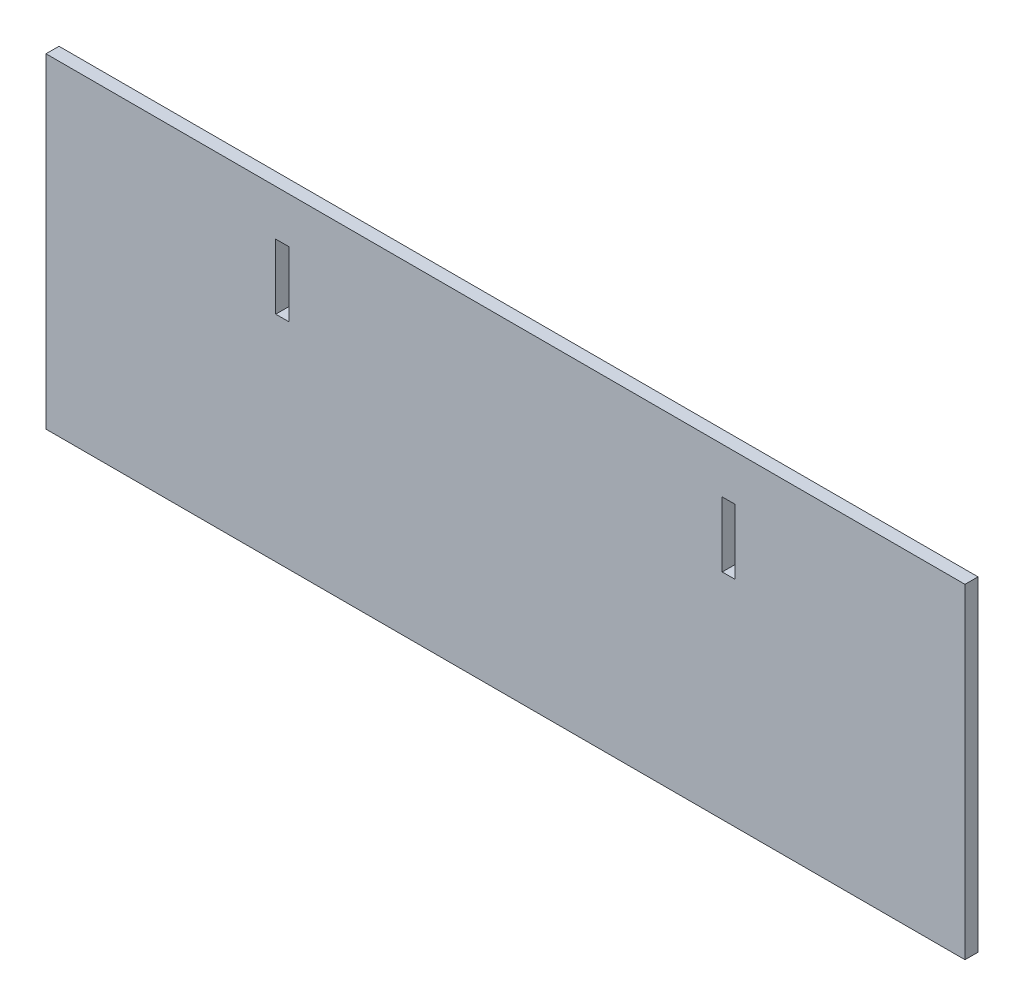
ISO-10303-21;
HEADER;
FILE_DESCRIPTION(('STEP AP214'),'2;1');
FILE_NAME('part.step','',(''),(''),'','','');
FILE_SCHEMA(('AUTOMOTIVE_DESIGN { 1 0 10303 214 1 1 1 1 }'));
ENDSEC;
DATA;
#1=APPLICATION_CONTEXT('core data for automotive mechanical design processes');
#2=APPLICATION_PROTOCOL_DEFINITION('international standard','automotive_design',2000,#1);
#3=PRODUCT_CONTEXT('',#1,'mechanical');
#4=PRODUCT('Part','Part','',(#3));
#5=PRODUCT_RELATED_PRODUCT_CATEGORY('part','',(#4));
#6=PRODUCT_DEFINITION_FORMATION('','',#4);
#7=PRODUCT_DEFINITION_CONTEXT('part definition',#1,'design');
#8=PRODUCT_DEFINITION('design','',#6,#7);
#9=PRODUCT_DEFINITION_SHAPE('','',#8);
#10=(LENGTH_UNIT() NAMED_UNIT(*) SI_UNIT(.MILLI.,.METRE.));
#11=(NAMED_UNIT(*) PLANE_ANGLE_UNIT() SI_UNIT($,.RADIAN.));
#12=(NAMED_UNIT(*) SI_UNIT($,.STERADIAN.) SOLID_ANGLE_UNIT());
#13=UNCERTAINTY_MEASURE_WITH_UNIT(LENGTH_MEASURE(1.E-05),#10,'distance_accuracy_value','');
#14=(GEOMETRIC_REPRESENTATION_CONTEXT(3) GLOBAL_UNCERTAINTY_ASSIGNED_CONTEXT((#13)) GLOBAL_UNIT_ASSIGNED_CONTEXT((#10,
#11,#12)) REPRESENTATION_CONTEXT('',''));
#15=CARTESIAN_POINT('',(0.,0.,0.));
#16=DIRECTION('',(0.,0.,1.));
#17=DIRECTION('',(1.,0.,0.));
#18=AXIS2_PLACEMENT_3D('',#15,#16,#17);
#19=CARTESIAN_POINT('',(0.,0.,3.));
#20=DIRECTION('',(0.,0.,-1.));
#21=DIRECTION('',(-1.,0.,0.));
#22=AXIS2_PLACEMENT_3D('',#19,#20,#21);
#23=PLANE('',#22);
#24=DIRECTION('',(0.,-1.,0.));
#25=VECTOR('',#24,1.);
#26=CARTESIAN_POINT('',(53.,64.47224362,3.));
#27=LINE('',#26,#25);
#28=CARTESIAN_POINT('',(53.,64.47224362,3.));
#29=VERTEX_POINT('',#28);
#30=CARTESIAN_POINT('',(53.,49.47224362,3.));
#31=VERTEX_POINT('',#30);
#32=EDGE_CURVE('E158',#29,#31,#27,.T.);
#33=ORIENTED_EDGE('',*,*,#32,.F.);
#34=DIRECTION('',(-1.,0.,0.));
#35=VECTOR('',#34,1.);
#36=CARTESIAN_POINT('',(53.,64.47224362,3.));
#37=LINE('',#36,#35);
#38=CARTESIAN_POINT('',(56.,64.47224362,3.));
#39=VERTEX_POINT('',#38);
#40=EDGE_CURVE('E166',#39,#29,#37,.T.);
#41=ORIENTED_EDGE('',*,*,#40,.F.);
#42=DIRECTION('',(0.,1.,0.));
#43=VECTOR('',#42,1.);
#44=CARTESIAN_POINT('',(56.,64.47224362,3.));
#45=LINE('',#44,#43);
#46=CARTESIAN_POINT('',(56.,49.47224362,3.));
#47=VERTEX_POINT('',#46);
#48=EDGE_CURVE('E163',#47,#39,#45,.T.);
#49=ORIENTED_EDGE('',*,*,#48,.F.);
#50=DIRECTION('',(1.,0.,0.));
#51=VECTOR('',#50,1.);
#52=CARTESIAN_POINT('',(53.,49.47224362,3.));
#53=LINE('',#52,#51);
#54=EDGE_CURVE('E160',#31,#47,#53,.T.);
#55=ORIENTED_EDGE('',*,*,#54,.F.);
#56=EDGE_LOOP('',(#33,#41,#49,#55));
#57=FACE_BOUND('',#56,.T.);
#58=DIRECTION('',(0.,-1.,0.));
#59=VECTOR('',#58,1.);
#60=CARTESIAN_POINT('',(0.,0.,3.));
#61=LINE('',#60,#59);
#62=CARTESIAN_POINT('',(0.,75.,3.));
#63=VERTEX_POINT('',#62);
#64=CARTESIAN_POINT('',(0.,0.,3.));
#65=VERTEX_POINT('',#64);
#66=EDGE_CURVE('E189',#63,#65,#61,.T.);
#67=ORIENTED_EDGE('',*,*,#66,.T.);
#68=DIRECTION('',(1.,0.,0.));
#69=VECTOR('',#68,1.);
#70=CARTESIAN_POINT('',(0.,0.,3.));
#71=LINE('',#70,#69);
#72=CARTESIAN_POINT('',(212.,0.,3.));
#73=VERTEX_POINT('',#72);
#74=EDGE_CURVE('E192',#65,#73,#71,.T.);
#75=ORIENTED_EDGE('',*,*,#74,.T.);
#76=DIRECTION('',(0.,1.,0.));
#77=VECTOR('',#76,1.);
#78=CARTESIAN_POINT('',(212.,0.,3.));
#79=LINE('',#78,#77);
#80=CARTESIAN_POINT('',(212.,75.,3.));
#81=VERTEX_POINT('',#80);
#82=EDGE_CURVE('E195',#73,#81,#79,.T.);
#83=ORIENTED_EDGE('',*,*,#82,.T.);
#84=DIRECTION('',(-1.,0.,0.));
#85=VECTOR('',#84,1.);
#86=CARTESIAN_POINT('',(0.,75.,3.));
#87=LINE('',#86,#85);
#88=EDGE_CURVE('E197',#81,#63,#87,.T.);
#89=ORIENTED_EDGE('',*,*,#88,.T.);
#90=EDGE_LOOP('',(#67,#75,#83,#89));
#91=FACE_BOUND('',#90,.T.);
#92=DIRECTION('',(0.,-1.,0.));
#93=VECTOR('',#92,1.);
#94=CARTESIAN_POINT('',(156.,64.47224362,3.));
#95=LINE('',#94,#93);
#96=CARTESIAN_POINT('',(156.,64.47224362,3.));
#97=VERTEX_POINT('',#96);
#98=CARTESIAN_POINT('',(156.,49.47224362,3.));
#99=VERTEX_POINT('',#98);
#100=EDGE_CURVE('E122',#97,#99,#95,.T.);
#101=ORIENTED_EDGE('',*,*,#100,.F.);
#102=DIRECTION('',(-1.,0.,0.));
#103=VECTOR('',#102,1.);
#104=CARTESIAN_POINT('',(156.,64.47224362,3.));
#105=LINE('',#104,#103);
#106=CARTESIAN_POINT('',(159.,64.47224362,3.));
#107=VERTEX_POINT('',#106);
#108=EDGE_CURVE('E144',#107,#97,#105,.T.);
#109=ORIENTED_EDGE('',*,*,#108,.F.);
#110=DIRECTION('',(0.,1.,0.));
#111=VECTOR('',#110,1.);
#112=CARTESIAN_POINT('',(159.,64.47224362,3.));
#113=LINE('',#112,#111);
#114=CARTESIAN_POINT('',(159.,49.47224362,3.));
#115=VERTEX_POINT('',#114);
#116=EDGE_CURVE('E142',#115,#107,#113,.T.);
#117=ORIENTED_EDGE('',*,*,#116,.F.);
#118=DIRECTION('',(1.,0.,0.));
#119=VECTOR('',#118,1.);
#120=CARTESIAN_POINT('',(156.,49.47224362,3.));
#121=LINE('',#120,#119);
#122=EDGE_CURVE('E130',#99,#115,#121,.T.);
#123=ORIENTED_EDGE('',*,*,#122,.F.);
#124=EDGE_LOOP('',(#101,#109,#117,#123));
#125=FACE_BOUND('',#124,.T.);
#126=ADVANCED_FACE('F33',(#57,#91,#125),#23,.F.);
#127=CARTESIAN_POINT('',(0.,0.,0.));
#128=DIRECTION('',(0.,0.,-1.));
#129=DIRECTION('',(-1.,0.,0.));
#130=AXIS2_PLACEMENT_3D('',#127,#128,#129);
#131=PLANE('',#130);
#132=DIRECTION('',(0.,-1.,0.));
#133=VECTOR('',#132,1.);
#134=CARTESIAN_POINT('',(0.,0.,0.));
#135=LINE('',#134,#133);
#136=CARTESIAN_POINT('',(0.,75.,0.));
#137=VERTEX_POINT('',#136);
#138=CARTESIAN_POINT('',(0.,0.,0.));
#139=VERTEX_POINT('',#138);
#140=EDGE_CURVE('E188',#137,#139,#135,.T.);
#141=ORIENTED_EDGE('',*,*,#140,.F.);
#142=DIRECTION('',(-1.,0.,0.));
#143=VECTOR('',#142,1.);
#144=CARTESIAN_POINT('',(0.,75.,0.));
#145=LINE('',#144,#143);
#146=CARTESIAN_POINT('',(212.,75.,0.));
#147=VERTEX_POINT('',#146);
#148=EDGE_CURVE('E193',#147,#137,#145,.T.);
#149=ORIENTED_EDGE('',*,*,#148,.F.);
#150=DIRECTION('',(0.,1.,0.));
#151=VECTOR('',#150,1.);
#152=CARTESIAN_POINT('',(212.,0.,0.));
#153=LINE('',#152,#151);
#154=CARTESIAN_POINT('',(212.,0.,0.));
#155=VERTEX_POINT('',#154);
#156=EDGE_CURVE('E204',#155,#147,#153,.T.);
#157=ORIENTED_EDGE('',*,*,#156,.F.);
#158=DIRECTION('',(1.,0.,0.));
#159=VECTOR('',#158,1.);
#160=CARTESIAN_POINT('',(0.,0.,0.));
#161=LINE('',#160,#159);
#162=EDGE_CURVE('E202',#139,#155,#161,.T.);
#163=ORIENTED_EDGE('',*,*,#162,.F.);
#164=EDGE_LOOP('',(#141,#149,#157,#163));
#165=FACE_BOUND('',#164,.T.);
#166=DIRECTION('',(-1.,0.,0.));
#167=VECTOR('',#166,1.);
#168=CARTESIAN_POINT('',(53.,64.47224362,0.));
#169=LINE('',#168,#167);
#170=CARTESIAN_POINT('',(56.,64.47224362,0.));
#171=VERTEX_POINT('',#170);
#172=CARTESIAN_POINT('',(53.,64.47224362,0.));
#173=VERTEX_POINT('',#172);
#174=EDGE_CURVE('E161',#171,#173,#169,.T.);
#175=ORIENTED_EDGE('',*,*,#174,.T.);
#176=DIRECTION('',(0.,-1.,0.));
#177=VECTOR('',#176,1.);
#178=CARTESIAN_POINT('',(53.,64.47224362,0.));
#179=LINE('',#178,#177);
#180=CARTESIAN_POINT('',(53.,49.47224362,0.));
#181=VERTEX_POINT('',#180);
#182=EDGE_CURVE('E138',#173,#181,#179,.T.);
#183=ORIENTED_EDGE('',*,*,#182,.T.);
#184=DIRECTION('',(1.,0.,0.));
#185=VECTOR('',#184,1.);
#186=CARTESIAN_POINT('',(53.,49.47224362,0.));
#187=LINE('',#186,#185);
#188=CARTESIAN_POINT('',(56.,49.47224362,0.));
#189=VERTEX_POINT('',#188);
#190=EDGE_CURVE('E171',#181,#189,#187,.T.);
#191=ORIENTED_EDGE('',*,*,#190,.T.);
#192=DIRECTION('',(0.,1.,0.));
#193=VECTOR('',#192,1.);
#194=CARTESIAN_POINT('',(56.,64.47224362,0.));
#195=LINE('',#194,#193);
#196=EDGE_CURVE('E174',#189,#171,#195,.T.);
#197=ORIENTED_EDGE('',*,*,#196,.T.);
#198=EDGE_LOOP('',(#175,#183,#191,#197));
#199=FACE_BOUND('',#198,.T.);
#200=DIRECTION('',(-1.,0.,0.));
#201=VECTOR('',#200,1.);
#202=CARTESIAN_POINT('',(156.,64.47224362,0.));
#203=LINE('',#202,#201);
#204=CARTESIAN_POINT('',(159.,64.47224362,0.));
#205=VERTEX_POINT('',#204);
#206=CARTESIAN_POINT('',(156.,64.47224362,0.));
#207=VERTEX_POINT('',#206);
#208=EDGE_CURVE('E131',#205,#207,#203,.T.);
#209=ORIENTED_EDGE('',*,*,#208,.T.);
#210=DIRECTION('',(0.,-1.,0.));
#211=VECTOR('',#210,1.);
#212=CARTESIAN_POINT('',(156.,64.47224362,0.));
#213=LINE('',#212,#211);
#214=CARTESIAN_POINT('',(156.,49.47224362,0.));
#215=VERTEX_POINT('',#214);
#216=EDGE_CURVE('E56',#207,#215,#213,.T.);
#217=ORIENTED_EDGE('',*,*,#216,.T.);
#218=DIRECTION('',(1.,0.,0.));
#219=VECTOR('',#218,1.);
#220=CARTESIAN_POINT('',(156.,49.47224362,0.));
#221=LINE('',#220,#219);
#222=CARTESIAN_POINT('',(159.,49.47224362,0.));
#223=VERTEX_POINT('',#222);
#224=EDGE_CURVE('E137',#215,#223,#221,.T.);
#225=ORIENTED_EDGE('',*,*,#224,.T.);
#226=DIRECTION('',(0.,1.,0.));
#227=VECTOR('',#226,1.);
#228=CARTESIAN_POINT('',(159.,64.47224362,0.));
#229=LINE('',#228,#227);
#230=EDGE_CURVE('E150',#223,#205,#229,.T.);
#231=ORIENTED_EDGE('',*,*,#230,.T.);
#232=EDGE_LOOP('',(#209,#217,#225,#231));
#233=FACE_BOUND('',#232,.T.);
#234=ADVANCED_FACE('F222',(#165,#199,#233),#131,.T.);
#235=CARTESIAN_POINT('',(0.,0.,3.));
#236=DIRECTION('',(1.,0.,0.));
#237=DIRECTION('',(0.,0.,-1.));
#238=AXIS2_PLACEMENT_3D('',#235,#236,#237);
#239=PLANE('',#238);
#240=ORIENTED_EDGE('',*,*,#140,.T.);
#241=DIRECTION('',(0.,0.,-1.));
#242=VECTOR('',#241,1.);
#243=CARTESIAN_POINT('',(0.,0.,3.));
#244=LINE('',#243,#242);
#245=EDGE_CURVE('E11',#65,#139,#244,.T.);
#246=ORIENTED_EDGE('',*,*,#245,.F.);
#247=ORIENTED_EDGE('',*,*,#66,.F.);
#248=DIRECTION('',(0.,0.,-1.));
#249=VECTOR('',#248,1.);
#250=CARTESIAN_POINT('',(0.,75.,3.));
#251=LINE('',#250,#249);
#252=EDGE_CURVE('E199',#63,#137,#251,.T.);
#253=ORIENTED_EDGE('',*,*,#252,.T.);
#254=EDGE_LOOP('',(#240,#246,#247,#253));
#255=FACE_BOUND('',#254,.T.);
#256=ADVANCED_FACE('F35',(#255),#239,.F.);
#257=CARTESIAN_POINT('',(0.,0.,3.));
#258=DIRECTION('',(0.,1.,0.));
#259=DIRECTION('',(0.,0.,1.));
#260=AXIS2_PLACEMENT_3D('',#257,#258,#259);
#261=PLANE('',#260);
#262=ORIENTED_EDGE('',*,*,#162,.T.);
#263=DIRECTION('',(0.,0.,-1.));
#264=VECTOR('',#263,1.);
#265=CARTESIAN_POINT('',(212.,0.,3.));
#266=LINE('',#265,#264);
#267=EDGE_CURVE('E41',#73,#155,#266,.T.);
#268=ORIENTED_EDGE('',*,*,#267,.F.);
#269=ORIENTED_EDGE('',*,*,#74,.F.);
#270=ORIENTED_EDGE('',*,*,#245,.T.);
#271=EDGE_LOOP('',(#262,#268,#269,#270));
#272=FACE_BOUND('',#271,.T.);
#273=ADVANCED_FACE('F232',(#272),#261,.F.);
#274=CARTESIAN_POINT('',(212.,0.,3.));
#275=DIRECTION('',(-1.,0.,0.));
#276=DIRECTION('',(0.,0.,1.));
#277=AXIS2_PLACEMENT_3D('',#274,#275,#276);
#278=PLANE('',#277);
#279=ORIENTED_EDGE('',*,*,#156,.T.);
#280=DIRECTION('',(0.,0.,-1.));
#281=VECTOR('',#280,1.);
#282=CARTESIAN_POINT('',(212.,75.,3.));
#283=LINE('',#282,#281);
#284=EDGE_CURVE('E209',#81,#147,#283,.T.);
#285=ORIENTED_EDGE('',*,*,#284,.F.);
#286=ORIENTED_EDGE('',*,*,#82,.F.);
#287=ORIENTED_EDGE('',*,*,#267,.T.);
#288=EDGE_LOOP('',(#279,#285,#286,#287));
#289=FACE_BOUND('',#288,.T.);
#290=ADVANCED_FACE('F216',(#289),#278,.F.);
#291=CARTESIAN_POINT('',(0.,75.,3.));
#292=DIRECTION('',(0.,-1.,0.));
#293=DIRECTION('',(0.,0.,-1.));
#294=AXIS2_PLACEMENT_3D('',#291,#292,#293);
#295=PLANE('',#294);
#296=ORIENTED_EDGE('',*,*,#148,.T.);
#297=ORIENTED_EDGE('',*,*,#252,.F.);
#298=ORIENTED_EDGE('',*,*,#88,.F.);
#299=ORIENTED_EDGE('',*,*,#284,.T.);
#300=EDGE_LOOP('',(#296,#297,#298,#299));
#301=FACE_BOUND('',#300,.T.);
#302=ADVANCED_FACE('F226',(#301),#295,.F.);
#303=CARTESIAN_POINT('',(53.,64.47224362,3.));
#304=DIRECTION('',(1.,0.,0.));
#305=DIRECTION('',(0.,0.,-1.));
#306=AXIS2_PLACEMENT_3D('',#303,#304,#305);
#307=PLANE('',#306);
#308=ORIENTED_EDGE('',*,*,#182,.F.);
#309=DIRECTION('',(0.,0.,-1.));
#310=VECTOR('',#309,1.);
#311=CARTESIAN_POINT('',(53.,64.47224362,3.));
#312=LINE('',#311,#310);
#313=EDGE_CURVE('E168',#29,#173,#312,.T.);
#314=ORIENTED_EDGE('',*,*,#313,.F.);
#315=ORIENTED_EDGE('',*,*,#32,.T.);
#316=DIRECTION('',(0.,0.,-1.));
#317=VECTOR('',#316,1.);
#318=CARTESIAN_POINT('',(53.,49.47224362,3.));
#319=LINE('',#318,#317);
#320=EDGE_CURVE('E185',#31,#181,#319,.T.);
#321=ORIENTED_EDGE('',*,*,#320,.T.);
#322=EDGE_LOOP('',(#308,#314,#315,#321));
#323=FACE_BOUND('',#322,.T.);
#324=ADVANCED_FACE('F248',(#323),#307,.T.);
#325=CARTESIAN_POINT('',(53.,49.47224362,3.));
#326=DIRECTION('',(0.,1.,0.));
#327=DIRECTION('',(-1.,0.,0.));
#328=AXIS2_PLACEMENT_3D('',#325,#326,#327);
#329=PLANE('',#328);
#330=ORIENTED_EDGE('',*,*,#190,.F.);
#331=ORIENTED_EDGE('',*,*,#320,.F.);
#332=ORIENTED_EDGE('',*,*,#54,.T.);
#333=DIRECTION('',(0.,0.,-1.));
#334=VECTOR('',#333,1.);
#335=CARTESIAN_POINT('',(56.,49.47224362,3.));
#336=LINE('',#335,#334);
#337=EDGE_CURVE('E183',#47,#189,#336,.T.);
#338=ORIENTED_EDGE('',*,*,#337,.T.);
#339=EDGE_LOOP('',(#330,#331,#332,#338));
#340=FACE_BOUND('',#339,.T.);
#341=ADVANCED_FACE('F255',(#340),#329,.T.);
#342=CARTESIAN_POINT('',(56.,64.47224362,3.));
#343=DIRECTION('',(-1.,0.,0.));
#344=DIRECTION('',(0.,-1.,0.));
#345=AXIS2_PLACEMENT_3D('',#342,#343,#344);
#346=PLANE('',#345);
#347=ORIENTED_EDGE('',*,*,#196,.F.);
#348=ORIENTED_EDGE('',*,*,#337,.F.);
#349=ORIENTED_EDGE('',*,*,#48,.T.);
#350=DIRECTION('',(0.,0.,-1.));
#351=VECTOR('',#350,1.);
#352=CARTESIAN_POINT('',(56.,64.47224362,3.));
#353=LINE('',#352,#351);
#354=EDGE_CURVE('E181',#39,#171,#353,.T.);
#355=ORIENTED_EDGE('',*,*,#354,.T.);
#356=EDGE_LOOP('',(#347,#348,#349,#355));
#357=FACE_BOUND('',#356,.T.);
#358=ADVANCED_FACE('F260',(#357),#346,.T.);
#359=CARTESIAN_POINT('',(53.,64.47224362,3.));
#360=DIRECTION('',(0.,-1.,0.));
#361=DIRECTION('',(1.,0.,0.));
#362=AXIS2_PLACEMENT_3D('',#359,#360,#361);
#363=PLANE('',#362);
#364=ORIENTED_EDGE('',*,*,#174,.F.);
#365=ORIENTED_EDGE('',*,*,#354,.F.);
#366=ORIENTED_EDGE('',*,*,#40,.T.);
#367=ORIENTED_EDGE('',*,*,#313,.T.);
#368=EDGE_LOOP('',(#364,#365,#366,#367));
#369=FACE_BOUND('',#368,.T.);
#370=ADVANCED_FACE('F266',(#369),#363,.T.);
#371=CARTESIAN_POINT('',(156.,64.47224362,3.));
#372=DIRECTION('',(1.,0.,0.));
#373=DIRECTION('',(0.,0.,-1.));
#374=AXIS2_PLACEMENT_3D('',#371,#372,#373);
#375=PLANE('',#374);
#376=ORIENTED_EDGE('',*,*,#216,.F.);
#377=DIRECTION('',(0.,0.,-1.));
#378=VECTOR('',#377,1.);
#379=CARTESIAN_POINT('',(156.,64.47224362,3.));
#380=LINE('',#379,#378);
#381=EDGE_CURVE('E126',#97,#207,#380,.T.);
#382=ORIENTED_EDGE('',*,*,#381,.F.);
#383=ORIENTED_EDGE('',*,*,#100,.T.);
#384=DIRECTION('',(0.,0.,-1.));
#385=VECTOR('',#384,1.);
#386=CARTESIAN_POINT('',(156.,49.47224362,3.));
#387=LINE('',#386,#385);
#388=EDGE_CURVE('E125',#99,#215,#387,.T.);
#389=ORIENTED_EDGE('',*,*,#388,.T.);
#390=EDGE_LOOP('',(#376,#382,#383,#389));
#391=FACE_BOUND('',#390,.T.);
#392=ADVANCED_FACE('F124',(#391),#375,.T.);
#393=CARTESIAN_POINT('',(156.,49.47224362,3.));
#394=DIRECTION('',(0.,1.,0.));
#395=DIRECTION('',(0.,0.,1.));
#396=AXIS2_PLACEMENT_3D('',#393,#394,#395);
#397=PLANE('',#396);
#398=ORIENTED_EDGE('',*,*,#224,.F.);
#399=ORIENTED_EDGE('',*,*,#388,.F.);
#400=ORIENTED_EDGE('',*,*,#122,.T.);
#401=DIRECTION('',(0.,0.,-1.));
#402=VECTOR('',#401,1.);
#403=CARTESIAN_POINT('',(159.,49.47224362,3.));
#404=LINE('',#403,#402);
#405=EDGE_CURVE('E139',#115,#223,#404,.T.);
#406=ORIENTED_EDGE('',*,*,#405,.T.);
#407=EDGE_LOOP('',(#398,#399,#400,#406));
#408=FACE_BOUND('',#407,.T.);
#409=ADVANCED_FACE('F134',(#408),#397,.T.);
#410=CARTESIAN_POINT('',(159.,64.47224362,3.));
#411=DIRECTION('',(-1.,0.,0.));
#412=DIRECTION('',(0.,0.,1.));
#413=AXIS2_PLACEMENT_3D('',#410,#411,#412);
#414=PLANE('',#413);
#415=ORIENTED_EDGE('',*,*,#230,.F.);
#416=ORIENTED_EDGE('',*,*,#405,.F.);
#417=ORIENTED_EDGE('',*,*,#116,.T.);
#418=DIRECTION('',(0.,0.,-1.));
#419=VECTOR('',#418,1.);
#420=CARTESIAN_POINT('',(159.,64.47224362,3.));
#421=LINE('',#420,#419);
#422=EDGE_CURVE('E48',#107,#205,#421,.T.);
#423=ORIENTED_EDGE('',*,*,#422,.T.);
#424=EDGE_LOOP('',(#415,#416,#417,#423));
#425=FACE_BOUND('',#424,.T.);
#426=ADVANCED_FACE('F285',(#425),#414,.T.);
#427=CARTESIAN_POINT('',(156.,64.47224362,3.));
#428=DIRECTION('',(0.,-1.,0.));
#429=DIRECTION('',(0.,0.,-1.));
#430=AXIS2_PLACEMENT_3D('',#427,#428,#429);
#431=PLANE('',#430);
#432=ORIENTED_EDGE('',*,*,#208,.F.);
#433=ORIENTED_EDGE('',*,*,#422,.F.);
#434=ORIENTED_EDGE('',*,*,#108,.T.);
#435=ORIENTED_EDGE('',*,*,#381,.T.);
#436=EDGE_LOOP('',(#432,#433,#434,#435));
#437=FACE_BOUND('',#436,.T.);
#438=ADVANCED_FACE('F288',(#437),#431,.T.);
#439=CLOSED_SHELL('',(#126,#234,#256,#273,#290,#302,#324,#341,#358,#370,#392,#409,#426,#438));
#440=MANIFOLD_SOLID_BREP('B2',#439);
#441=ADVANCED_BREP_SHAPE_REPRESENTATION('',(#18,#440),#14);
#442=SHAPE_DEFINITION_REPRESENTATION(#9,#441);
ENDSEC;
END-ISO-10303-21;
